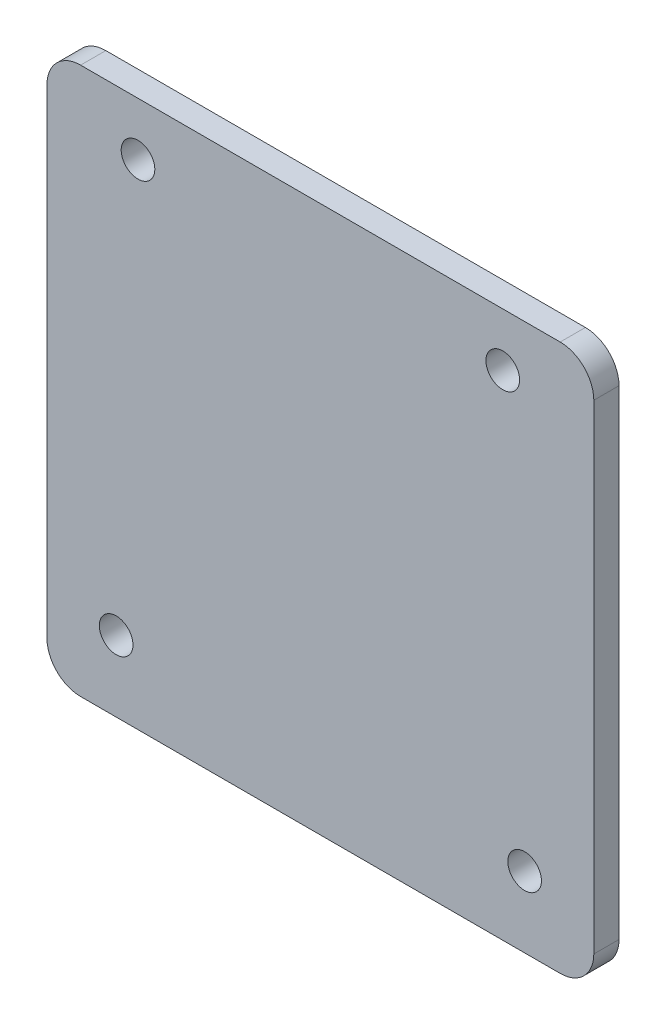
ISO-10303-21;
HEADER;
FILE_DESCRIPTION(('STEP AP214'),'2;1');
FILE_NAME('part.step','',(''),(''),'','','');
FILE_SCHEMA(('AUTOMOTIVE_DESIGN { 1 0 10303 214 1 1 1 1 }'));
ENDSEC;
DATA;
#1=APPLICATION_CONTEXT('core data for automotive mechanical design processes');
#2=APPLICATION_PROTOCOL_DEFINITION('international standard','automotive_design',2000,#1);
#3=PRODUCT_CONTEXT('',#1,'mechanical');
#4=PRODUCT('Part','Part','',(#3));
#5=PRODUCT_RELATED_PRODUCT_CATEGORY('part','',(#4));
#6=PRODUCT_DEFINITION_FORMATION('','',#4);
#7=PRODUCT_DEFINITION_CONTEXT('part definition',#1,'design');
#8=PRODUCT_DEFINITION('design','',#6,#7);
#9=PRODUCT_DEFINITION_SHAPE('','',#8);
#10=(LENGTH_UNIT() NAMED_UNIT(*) SI_UNIT(.MILLI.,.METRE.));
#11=(NAMED_UNIT(*) PLANE_ANGLE_UNIT() SI_UNIT($,.RADIAN.));
#12=(NAMED_UNIT(*) SI_UNIT($,.STERADIAN.) SOLID_ANGLE_UNIT());
#13=UNCERTAINTY_MEASURE_WITH_UNIT(LENGTH_MEASURE(1.E-05),#10,'distance_accuracy_value','');
#14=(GEOMETRIC_REPRESENTATION_CONTEXT(3) GLOBAL_UNCERTAINTY_ASSIGNED_CONTEXT((#13)) GLOBAL_UNIT_ASSIGNED_CONTEXT((#10,
#11,#12)) REPRESENTATION_CONTEXT('',''));
#15=CARTESIAN_POINT('',(0.,0.,0.));
#16=DIRECTION('',(0.,0.,1.));
#17=DIRECTION('',(1.,0.,0.));
#18=AXIS2_PLACEMENT_3D('',#15,#16,#17);
#19=CARTESIAN_POINT('',(15.2001735792992,34.2310543366326,3.));
#20=DIRECTION('',(0.,0.,1.));
#21=DIRECTION('',(1.,0.,0.));
#22=AXIS2_PLACEMENT_3D('',#19,#20,#21);
#23=PLANE('',#22);
#24=CARTESIAN_POINT('',(65.4298715324604,88.9607522898293,3.));
#25=DIRECTION('',(0.,0.,1.));
#26=DIRECTION('',(1.,0.,0.));
#27=AXIS2_PLACEMENT_3D('',#24,#25,#26);
#28=CIRCLE('',#27,2.);
#29=CARTESIAN_POINT('',(67.4298715324604,88.9607522898293,3.));
#30=VERTEX_POINT('',#29);
#31=EDGE_CURVE('E188',#30,#30,#28,.T.);
#32=ORIENTED_EDGE('',*,*,#31,.F.);
#33=EDGE_LOOP('',(#32));
#34=FACE_BOUND('',#33,.T.);
#35=CARTESIAN_POINT('',(19.4298715324604,38.6607522898293,3.));
#36=DIRECTION('',(0.,0.,1.));
#37=DIRECTION('',(1.,0.,0.));
#38=AXIS2_PLACEMENT_3D('',#35,#36,#37);
#39=CIRCLE('',#38,2.00000000000001);
#40=CARTESIAN_POINT('',(21.4298715324604,38.6607522898293,3.));
#41=VERTEX_POINT('',#40);
#42=EDGE_CURVE('E134',#41,#41,#39,.T.);
#43=ORIENTED_EDGE('',*,*,#42,.F.);
#44=EDGE_LOOP('',(#43));
#45=FACE_BOUND('',#44,.T.);
#46=CARTESIAN_POINT('',(15.2001735792992,34.2310543366326,3.));
#47=DIRECTION('',(0.,0.,1.));
#48=DIRECTION('',(1.,0.,0.));
#49=AXIS2_PLACEMENT_3D('',#46,#47,#48);
#50=CIRCLE('',#49,4.);
#51=CARTESIAN_POINT('',(11.2001735792992,34.2310543366326,3.));
#52=VERTEX_POINT('',#51);
#53=CARTESIAN_POINT('',(15.2001735792992,30.2310543366326,3.));
#54=VERTEX_POINT('',#53);
#55=EDGE_CURVE('E145',#52,#54,#50,.T.);
#56=ORIENTED_EDGE('',*,*,#55,.T.);
#57=DIRECTION('',(1.,0.,0.));
#58=VECTOR('',#57,1.);
#59=CARTESIAN_POINT('',(15.2001735792992,30.2310543366326,3.));
#60=LINE('',#59,#58);
#61=CARTESIAN_POINT('',(72.2595694856634,30.2310543366326,3.));
#62=VERTEX_POINT('',#61);
#63=EDGE_CURVE('E93',#54,#62,#60,.T.);
#64=ORIENTED_EDGE('',*,*,#63,.T.);
#65=CARTESIAN_POINT('',(72.2595694856634,34.2310543366326,3.));
#66=DIRECTION('',(0.,0.,1.));
#67=DIRECTION('',(1.,0.,0.));
#68=AXIS2_PLACEMENT_3D('',#65,#66,#67);
#69=CIRCLE('',#68,4.00000000000001);
#70=CARTESIAN_POINT('',(76.2595694856635,34.2310543366326,3.));
#71=VERTEX_POINT('',#70);
#72=EDGE_CURVE('E160',#62,#71,#69,.T.);
#73=ORIENTED_EDGE('',*,*,#72,.T.);
#74=DIRECTION('',(0.,1.,0.));
#75=VECTOR('',#74,1.);
#76=CARTESIAN_POINT('',(76.2595694856635,91.2904502429968,3.));
#77=LINE('',#76,#75);
#78=CARTESIAN_POINT('',(76.2595694856634,91.2904502429968,3.));
#79=VERTEX_POINT('',#78);
#80=EDGE_CURVE('E173',#71,#79,#77,.T.);
#81=ORIENTED_EDGE('',*,*,#80,.T.);
#82=CARTESIAN_POINT('',(72.2595694856634,91.2904502429968,3.));
#83=DIRECTION('',(0.,0.,1.));
#84=DIRECTION('',(-1.,0.,0.));
#85=AXIS2_PLACEMENT_3D('',#82,#83,#84);
#86=CIRCLE('',#85,4.00000000000001);
#87=CARTESIAN_POINT('',(72.2595694856634,95.2904502429968,3.));
#88=VERTEX_POINT('',#87);
#89=EDGE_CURVE('E112',#79,#88,#86,.T.);
#90=ORIENTED_EDGE('',*,*,#89,.T.);
#91=DIRECTION('',(-1.,0.,0.));
#92=VECTOR('',#91,1.);
#93=CARTESIAN_POINT('',(15.2001735792992,95.2904502429968,3.));
#94=LINE('',#93,#92);
#95=CARTESIAN_POINT('',(15.2001735792992,95.2904502429968,3.));
#96=VERTEX_POINT('',#95);
#97=EDGE_CURVE('E106',#88,#96,#94,.T.);
#98=ORIENTED_EDGE('',*,*,#97,.T.);
#99=CARTESIAN_POINT('',(15.2001735792992,91.2904502429968,3.));
#100=DIRECTION('',(0.,0.,1.));
#101=DIRECTION('',(1.,0.,0.));
#102=AXIS2_PLACEMENT_3D('',#99,#100,#101);
#103=CIRCLE('',#102,4.);
#104=CARTESIAN_POINT('',(11.2001735792992,91.2904502429968,3.));
#105=VERTEX_POINT('',#104);
#106=EDGE_CURVE('E110',#96,#105,#103,.T.);
#107=ORIENTED_EDGE('',*,*,#106,.T.);
#108=DIRECTION('',(0.,-1.,0.));
#109=VECTOR('',#108,1.);
#110=CARTESIAN_POINT('',(11.2001735792992,91.2904502429968,3.));
#111=LINE('',#110,#109);
#112=EDGE_CURVE('E50',#105,#52,#111,.T.);
#113=ORIENTED_EDGE('',*,*,#112,.T.);
#114=EDGE_LOOP('',(#56,#64,#73,#81,#90,#98,#107,#113));
#115=FACE_BOUND('',#114,.T.);
#116=CARTESIAN_POINT('',(68.0298715324604,38.6607522898293,3.));
#117=DIRECTION('',(0.,0.,1.));
#118=DIRECTION('',(1.,0.,0.));
#119=AXIS2_PLACEMENT_3D('',#116,#117,#118);
#120=CIRCLE('',#119,2.);
#121=CARTESIAN_POINT('',(70.0298715324604,38.6607522898293,3.));
#122=VERTEX_POINT('',#121);
#123=EDGE_CURVE('E182',#122,#122,#120,.T.);
#124=ORIENTED_EDGE('',*,*,#123,.F.);
#125=EDGE_LOOP('',(#124));
#126=FACE_BOUND('',#125,.T.);
#127=CARTESIAN_POINT('',(22.0298715324604,88.9607522898293,3.));
#128=DIRECTION('',(0.,0.,1.));
#129=DIRECTION('',(1.,0.,0.));
#130=AXIS2_PLACEMENT_3D('',#127,#128,#129);
#131=CIRCLE('',#130,2.00000000000001);
#132=CARTESIAN_POINT('',(24.0298715324604,88.9607522898293,3.));
#133=VERTEX_POINT('',#132);
#134=EDGE_CURVE('E194',#133,#133,#131,.T.);
#135=ORIENTED_EDGE('',*,*,#134,.F.);
#136=EDGE_LOOP('',(#135));
#137=FACE_BOUND('',#136,.T.);
#138=ADVANCED_FACE('F33',(#34,#45,#115,#126,#137),#23,.T.);
#139=CARTESIAN_POINT('',(15.2001735792992,34.2310543366326,0.));
#140=DIRECTION('',(0.,0.,1.));
#141=DIRECTION('',(1.,0.,0.));
#142=AXIS2_PLACEMENT_3D('',#139,#140,#141);
#143=PLANE('',#142);
#144=CARTESIAN_POINT('',(15.2001735792992,34.2310543366326,0.));
#145=DIRECTION('',(0.,0.,1.));
#146=DIRECTION('',(1.,0.,0.));
#147=AXIS2_PLACEMENT_3D('',#144,#145,#146);
#148=CIRCLE('',#147,4.);
#149=CARTESIAN_POINT('',(11.2001735792992,34.2310543366326,0.));
#150=VERTEX_POINT('',#149);
#151=CARTESIAN_POINT('',(15.2001735792992,30.2310543366326,0.));
#152=VERTEX_POINT('',#151);
#153=EDGE_CURVE('E130',#150,#152,#148,.T.);
#154=ORIENTED_EDGE('',*,*,#153,.F.);
#155=DIRECTION('',(0.,-1.,0.));
#156=VECTOR('',#155,1.);
#157=CARTESIAN_POINT('',(11.2001735792992,91.2904502429968,0.));
#158=LINE('',#157,#156);
#159=CARTESIAN_POINT('',(11.2001735792992,91.2904502429968,0.));
#160=VERTEX_POINT('',#159);
#161=EDGE_CURVE('E85',#160,#150,#158,.T.);
#162=ORIENTED_EDGE('',*,*,#161,.F.);
#163=CARTESIAN_POINT('',(15.2001735792992,91.2904502429968,0.));
#164=DIRECTION('',(0.,0.,1.));
#165=DIRECTION('',(1.,0.,0.));
#166=AXIS2_PLACEMENT_3D('',#163,#164,#165);
#167=CIRCLE('',#166,4.);
#168=CARTESIAN_POINT('',(15.2001735792992,95.2904502429968,0.));
#169=VERTEX_POINT('',#168);
#170=EDGE_CURVE('E79',#169,#160,#167,.T.);
#171=ORIENTED_EDGE('',*,*,#170,.F.);
#172=DIRECTION('',(-1.,0.,0.));
#173=VECTOR('',#172,1.);
#174=CARTESIAN_POINT('',(15.2001735792992,95.2904502429968,0.));
#175=LINE('',#174,#173);
#176=CARTESIAN_POINT('',(72.2595694856634,95.2904502429968,0.));
#177=VERTEX_POINT('',#176);
#178=EDGE_CURVE('E120',#177,#169,#175,.T.);
#179=ORIENTED_EDGE('',*,*,#178,.F.);
#180=CARTESIAN_POINT('',(72.2595694856634,91.2904502429968,0.));
#181=DIRECTION('',(0.,0.,1.));
#182=DIRECTION('',(-1.,0.,0.));
#183=AXIS2_PLACEMENT_3D('',#180,#181,#182);
#184=CIRCLE('',#183,4.00000000000001);
#185=CARTESIAN_POINT('',(76.2595694856634,91.2904502429968,0.));
#186=VERTEX_POINT('',#185);
#187=EDGE_CURVE('E140',#186,#177,#184,.T.);
#188=ORIENTED_EDGE('',*,*,#187,.F.);
#189=DIRECTION('',(0.,1.,0.));
#190=VECTOR('',#189,1.);
#191=CARTESIAN_POINT('',(76.2595694856635,91.2904502429968,0.));
#192=LINE('',#191,#190);
#193=CARTESIAN_POINT('',(76.2595694856635,34.2310543366326,0.));
#194=VERTEX_POINT('',#193);
#195=EDGE_CURVE('E138',#194,#186,#192,.T.);
#196=ORIENTED_EDGE('',*,*,#195,.F.);
#197=CARTESIAN_POINT('',(72.2595694856634,34.2310543366326,0.));
#198=DIRECTION('',(0.,0.,1.));
#199=DIRECTION('',(1.,0.,0.));
#200=AXIS2_PLACEMENT_3D('',#197,#198,#199);
#201=CIRCLE('',#200,4.00000000000001);
#202=CARTESIAN_POINT('',(72.2595694856634,30.2310543366326,0.));
#203=VERTEX_POINT('',#202);
#204=EDGE_CURVE('E136',#203,#194,#201,.T.);
#205=ORIENTED_EDGE('',*,*,#204,.F.);
#206=DIRECTION('',(1.,0.,0.));
#207=VECTOR('',#206,1.);
#208=CARTESIAN_POINT('',(15.2001735792992,30.2310543366326,0.));
#209=LINE('',#208,#207);
#210=EDGE_CURVE('E133',#152,#203,#209,.T.);
#211=ORIENTED_EDGE('',*,*,#210,.F.);
#212=EDGE_LOOP('',(#154,#162,#171,#179,#188,#196,#205,#211));
#213=FACE_BOUND('',#212,.T.);
#214=CARTESIAN_POINT('',(19.4298715324604,38.6607522898293,0.));
#215=DIRECTION('',(0.,0.,1.));
#216=DIRECTION('',(1.,0.,0.));
#217=AXIS2_PLACEMENT_3D('',#214,#215,#216);
#218=CIRCLE('',#217,2.00000000000001);
#219=CARTESIAN_POINT('',(21.4298715324604,38.6607522898293,0.));
#220=VERTEX_POINT('',#219);
#221=EDGE_CURVE('E179',#220,#220,#218,.T.);
#222=ORIENTED_EDGE('',*,*,#221,.T.);
#223=EDGE_LOOP('',(#222));
#224=FACE_BOUND('',#223,.T.);
#225=CARTESIAN_POINT('',(68.0298715324604,38.6607522898293,0.));
#226=DIRECTION('',(0.,0.,1.));
#227=DIRECTION('',(1.,0.,0.));
#228=AXIS2_PLACEMENT_3D('',#225,#226,#227);
#229=CIRCLE('',#228,2.);
#230=CARTESIAN_POINT('',(70.0298715324604,38.6607522898293,0.));
#231=VERTEX_POINT('',#230);
#232=EDGE_CURVE('E185',#231,#231,#229,.T.);
#233=ORIENTED_EDGE('',*,*,#232,.T.);
#234=EDGE_LOOP('',(#233));
#235=FACE_BOUND('',#234,.T.);
#236=CARTESIAN_POINT('',(65.4298715324604,88.9607522898293,0.));
#237=DIRECTION('',(0.,0.,1.));
#238=DIRECTION('',(1.,0.,0.));
#239=AXIS2_PLACEMENT_3D('',#236,#237,#238);
#240=CIRCLE('',#239,2.);
#241=CARTESIAN_POINT('',(67.4298715324604,88.9607522898293,0.));
#242=VERTEX_POINT('',#241);
#243=EDGE_CURVE('E191',#242,#242,#240,.T.);
#244=ORIENTED_EDGE('',*,*,#243,.T.);
#245=EDGE_LOOP('',(#244));
#246=FACE_BOUND('',#245,.T.);
#247=CARTESIAN_POINT('',(22.0298715324604,88.9607522898293,0.));
#248=DIRECTION('',(0.,0.,1.));
#249=DIRECTION('',(1.,0.,0.));
#250=AXIS2_PLACEMENT_3D('',#247,#248,#249);
#251=CIRCLE('',#250,2.00000000000001);
#252=CARTESIAN_POINT('',(24.0298715324604,88.9607522898293,0.));
#253=VERTEX_POINT('',#252);
#254=EDGE_CURVE('E197',#253,#253,#251,.T.);
#255=ORIENTED_EDGE('',*,*,#254,.T.);
#256=EDGE_LOOP('',(#255));
#257=FACE_BOUND('',#256,.T.);
#258=ADVANCED_FACE('F164',(#213,#224,#235,#246,#257),#143,.F.);
#259=CARTESIAN_POINT('',(15.2001735792992,34.2310543366326,3.));
#260=DIRECTION('',(0.,0.,-1.));
#261=DIRECTION('',(-1.,0.,0.));
#262=AXIS2_PLACEMENT_3D('',#259,#260,#261);
#263=CYLINDRICAL_SURFACE('',#262,4.);
#264=ORIENTED_EDGE('',*,*,#153,.T.);
#265=DIRECTION('',(0.,0.,-1.));
#266=VECTOR('',#265,1.);
#267=CARTESIAN_POINT('',(15.2001735792992,30.2310543366326,3.));
#268=LINE('',#267,#266);
#269=EDGE_CURVE('E11',#54,#152,#268,.T.);
#270=ORIENTED_EDGE('',*,*,#269,.F.);
#271=ORIENTED_EDGE('',*,*,#55,.F.);
#272=DIRECTION('',(0.,0.,-1.));
#273=VECTOR('',#272,1.);
#274=CARTESIAN_POINT('',(11.2001735792992,34.2310543366326,3.));
#275=LINE('',#274,#273);
#276=EDGE_CURVE('E126',#52,#150,#275,.T.);
#277=ORIENTED_EDGE('',*,*,#276,.T.);
#278=EDGE_LOOP('',(#264,#270,#271,#277));
#279=FACE_BOUND('',#278,.T.);
#280=ADVANCED_FACE('F35',(#279),#263,.T.);
#281=CARTESIAN_POINT('',(15.2001735792992,30.2310543366326,3.));
#282=DIRECTION('',(0.,1.,0.));
#283=DIRECTION('',(-1.,0.,0.));
#284=AXIS2_PLACEMENT_3D('',#281,#282,#283);
#285=PLANE('',#284);
#286=ORIENTED_EDGE('',*,*,#210,.T.);
#287=DIRECTION('',(0.,0.,-1.));
#288=VECTOR('',#287,1.);
#289=CARTESIAN_POINT('',(72.2595694856634,30.2310543366326,3.));
#290=LINE('',#289,#288);
#291=EDGE_CURVE('E42',#62,#203,#290,.T.);
#292=ORIENTED_EDGE('',*,*,#291,.F.);
#293=ORIENTED_EDGE('',*,*,#63,.F.);
#294=ORIENTED_EDGE('',*,*,#269,.T.);
#295=EDGE_LOOP('',(#286,#292,#293,#294));
#296=FACE_BOUND('',#295,.T.);
#297=ADVANCED_FACE('F231',(#296),#285,.F.);
#298=CARTESIAN_POINT('',(72.2595694856634,34.2310543366326,3.));
#299=DIRECTION('',(0.,0.,-1.));
#300=DIRECTION('',(-1.,0.,0.));
#301=AXIS2_PLACEMENT_3D('',#298,#299,#300);
#302=CYLINDRICAL_SURFACE('',#301,4.00000000000001);
#303=ORIENTED_EDGE('',*,*,#204,.T.);
#304=DIRECTION('',(0.,0.,-1.));
#305=VECTOR('',#304,1.);
#306=CARTESIAN_POINT('',(76.2595694856635,34.2310543366326,3.));
#307=LINE('',#306,#305);
#308=EDGE_CURVE('E152',#71,#194,#307,.T.);
#309=ORIENTED_EDGE('',*,*,#308,.F.);
#310=ORIENTED_EDGE('',*,*,#72,.F.);
#311=ORIENTED_EDGE('',*,*,#291,.T.);
#312=EDGE_LOOP('',(#303,#309,#310,#311));
#313=FACE_BOUND('',#312,.T.);
#314=ADVANCED_FACE('F158',(#313),#302,.T.);
#315=CARTESIAN_POINT('',(76.2595694856635,91.2904502429968,3.));
#316=DIRECTION('',(-1.,0.,0.));
#317=DIRECTION('',(0.,0.,1.));
#318=AXIS2_PLACEMENT_3D('',#315,#316,#317);
#319=PLANE('',#318);
#320=ORIENTED_EDGE('',*,*,#195,.T.);
#321=DIRECTION('',(0.,0.,-1.));
#322=VECTOR('',#321,1.);
#323=CARTESIAN_POINT('',(76.2595694856634,91.2904502429968,3.));
#324=LINE('',#323,#322);
#325=EDGE_CURVE('E149',#79,#186,#324,.T.);
#326=ORIENTED_EDGE('',*,*,#325,.F.);
#327=ORIENTED_EDGE('',*,*,#80,.F.);
#328=ORIENTED_EDGE('',*,*,#308,.T.);
#329=EDGE_LOOP('',(#320,#326,#327,#328));
#330=FACE_BOUND('',#329,.T.);
#331=ADVANCED_FACE('F169',(#330),#319,.F.);
#332=CARTESIAN_POINT('',(72.2595694856634,91.2904502429968,3.));
#333=DIRECTION('',(0.,0.,-1.));
#334=DIRECTION('',(-1.,0.,0.));
#335=AXIS2_PLACEMENT_3D('',#332,#333,#334);
#336=CYLINDRICAL_SURFACE('',#335,4.00000000000001);
#337=ORIENTED_EDGE('',*,*,#187,.T.);
#338=DIRECTION('',(0.,0.,-1.));
#339=VECTOR('',#338,1.);
#340=CARTESIAN_POINT('',(72.2595694856634,95.2904502429968,3.));
#341=LINE('',#340,#339);
#342=EDGE_CURVE('E121',#88,#177,#341,.T.);
#343=ORIENTED_EDGE('',*,*,#342,.F.);
#344=ORIENTED_EDGE('',*,*,#89,.F.);
#345=ORIENTED_EDGE('',*,*,#325,.T.);
#346=EDGE_LOOP('',(#337,#343,#344,#345));
#347=FACE_BOUND('',#346,.T.);
#348=ADVANCED_FACE('F172',(#347),#336,.T.);
#349=CARTESIAN_POINT('',(15.2001735792992,95.2904502429968,3.));
#350=DIRECTION('',(0.,-1.,0.));
#351=DIRECTION('',(1.,0.,0.));
#352=AXIS2_PLACEMENT_3D('',#349,#350,#351);
#353=PLANE('',#352);
#354=ORIENTED_EDGE('',*,*,#178,.T.);
#355=DIRECTION('',(0.,0.,-1.));
#356=VECTOR('',#355,1.);
#357=CARTESIAN_POINT('',(15.2001735792992,95.2904502429968,3.));
#358=LINE('',#357,#356);
#359=EDGE_CURVE('E117',#96,#169,#358,.T.);
#360=ORIENTED_EDGE('',*,*,#359,.F.);
#361=ORIENTED_EDGE('',*,*,#97,.F.);
#362=ORIENTED_EDGE('',*,*,#342,.T.);
#363=EDGE_LOOP('',(#354,#360,#361,#362));
#364=FACE_BOUND('',#363,.T.);
#365=ADVANCED_FACE('F118',(#364),#353,.F.);
#366=CARTESIAN_POINT('',(15.2001735792992,91.2904502429968,3.));
#367=DIRECTION('',(0.,0.,-1.));
#368=DIRECTION('',(-1.,0.,0.));
#369=AXIS2_PLACEMENT_3D('',#366,#367,#368);
#370=CYLINDRICAL_SURFACE('',#369,4.);
#371=ORIENTED_EDGE('',*,*,#170,.T.);
#372=DIRECTION('',(0.,0.,-1.));
#373=VECTOR('',#372,1.);
#374=CARTESIAN_POINT('',(11.2001735792992,91.2904502429968,3.));
#375=LINE('',#374,#373);
#376=EDGE_CURVE('E122',#105,#160,#375,.T.);
#377=ORIENTED_EDGE('',*,*,#376,.F.);
#378=ORIENTED_EDGE('',*,*,#106,.F.);
#379=ORIENTED_EDGE('',*,*,#359,.T.);
#380=EDGE_LOOP('',(#371,#377,#378,#379));
#381=FACE_BOUND('',#380,.T.);
#382=ADVANCED_FACE('F124',(#381),#370,.T.);
#383=CARTESIAN_POINT('',(11.2001735792992,91.2904502429968,3.));
#384=DIRECTION('',(1.,0.,0.));
#385=DIRECTION('',(0.,1.,0.));
#386=AXIS2_PLACEMENT_3D('',#383,#384,#385);
#387=PLANE('',#386);
#388=ORIENTED_EDGE('',*,*,#161,.T.);
#389=ORIENTED_EDGE('',*,*,#276,.F.);
#390=ORIENTED_EDGE('',*,*,#112,.F.);
#391=ORIENTED_EDGE('',*,*,#376,.T.);
#392=EDGE_LOOP('',(#388,#389,#390,#391));
#393=FACE_BOUND('',#392,.T.);
#394=ADVANCED_FACE('F219',(#393),#387,.F.);
#395=CARTESIAN_POINT('',(19.4298715324604,38.6607522898293,3.));
#396=DIRECTION('',(0.,0.,-1.));
#397=DIRECTION('',(-1.,0.,0.));
#398=AXIS2_PLACEMENT_3D('',#395,#396,#397);
#399=CYLINDRICAL_SURFACE('',#398,2.00000000000001);
#400=ORIENTED_EDGE('',*,*,#42,.T.);
#401=EDGE_LOOP('',(#400));
#402=FACE_BOUND('',#401,.T.);
#403=ORIENTED_EDGE('',*,*,#221,.F.);
#404=EDGE_LOOP('',(#403));
#405=FACE_BOUND('',#404,.T.);
#406=ADVANCED_FACE('F216',(#402,#405),#399,.F.);
#407=CARTESIAN_POINT('',(68.0298715324604,38.6607522898293,3.));
#408=DIRECTION('',(0.,0.,-1.));
#409=DIRECTION('',(-1.,0.,0.));
#410=AXIS2_PLACEMENT_3D('',#407,#408,#409);
#411=CYLINDRICAL_SURFACE('',#410,2.);
#412=ORIENTED_EDGE('',*,*,#123,.T.);
#413=EDGE_LOOP('',(#412));
#414=FACE_BOUND('',#413,.T.);
#415=ORIENTED_EDGE('',*,*,#232,.F.);
#416=EDGE_LOOP('',(#415));
#417=FACE_BOUND('',#416,.T.);
#418=ADVANCED_FACE('F295',(#414,#417),#411,.F.);
#419=CARTESIAN_POINT('',(65.4298715324604,88.9607522898293,3.));
#420=DIRECTION('',(0.,0.,-1.));
#421=DIRECTION('',(-1.,0.,0.));
#422=AXIS2_PLACEMENT_3D('',#419,#420,#421);
#423=CYLINDRICAL_SURFACE('',#422,2.);
#424=ORIENTED_EDGE('',*,*,#31,.T.);
#425=EDGE_LOOP('',(#424));
#426=FACE_BOUND('',#425,.T.);
#427=ORIENTED_EDGE('',*,*,#243,.F.);
#428=EDGE_LOOP('',(#427));
#429=FACE_BOUND('',#428,.T.);
#430=ADVANCED_FACE('F303',(#426,#429),#423,.F.);
#431=CARTESIAN_POINT('',(22.0298715324604,88.9607522898293,3.));
#432=DIRECTION('',(0.,0.,-1.));
#433=DIRECTION('',(-1.,0.,0.));
#434=AXIS2_PLACEMENT_3D('',#431,#432,#433);
#435=CYLINDRICAL_SURFACE('',#434,2.00000000000001);
#436=ORIENTED_EDGE('',*,*,#134,.T.);
#437=EDGE_LOOP('',(#436));
#438=FACE_BOUND('',#437,.T.);
#439=ORIENTED_EDGE('',*,*,#254,.F.);
#440=EDGE_LOOP('',(#439));
#441=FACE_BOUND('',#440,.T.);
#442=ADVANCED_FACE('F203',(#438,#441),#435,.F.);
#443=CLOSED_SHELL('',(#138,#258,#280,#297,#314,#331,#348,#365,#382,#394,#406,#418,#430,#442));
#444=MANIFOLD_SOLID_BREP('B2',#443);
#445=ADVANCED_BREP_SHAPE_REPRESENTATION('',(#18,#444),#14);
#446=SHAPE_DEFINITION_REPRESENTATION(#9,#445);
ENDSEC;
END-ISO-10303-21;
